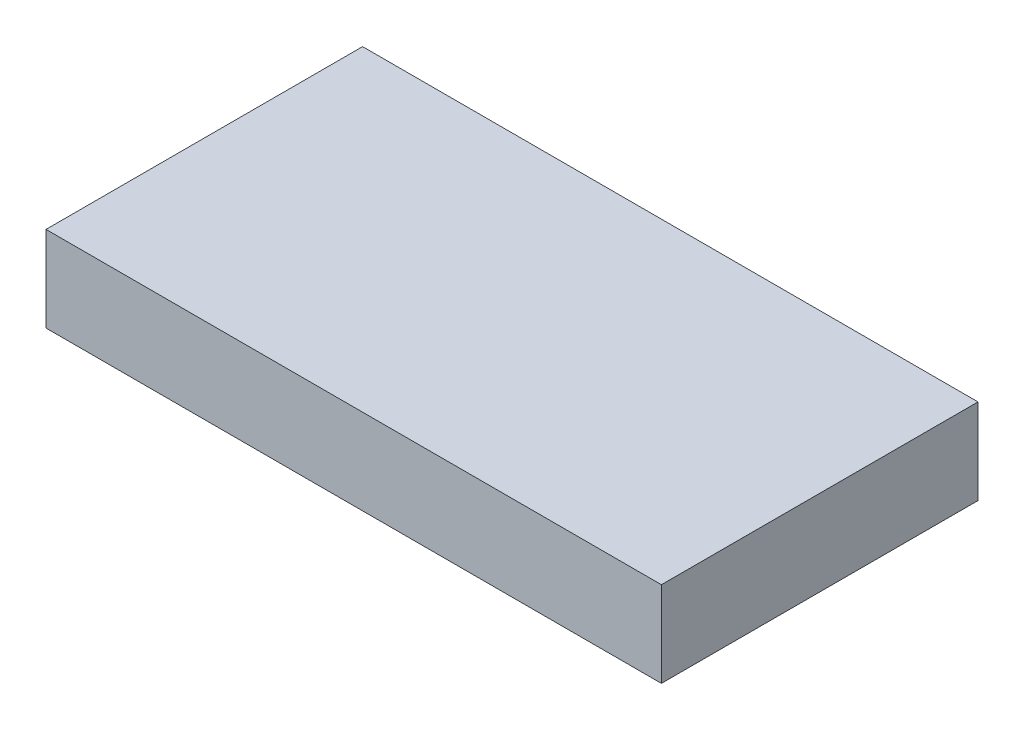
ISO-10303-21;
HEADER;
FILE_DESCRIPTION(('STEP AP214'),'2;1');
FILE_NAME('part.step','',(''),(''),'','','');
FILE_SCHEMA(('AUTOMOTIVE_DESIGN { 1 0 10303 214 1 1 1 1 }'));
ENDSEC;
DATA;
#1=APPLICATION_CONTEXT('core data for automotive mechanical design processes');
#2=APPLICATION_PROTOCOL_DEFINITION('international standard','automotive_design',2000,#1);
#3=PRODUCT_CONTEXT('',#1,'mechanical');
#4=PRODUCT('Part','Part','',(#3));
#5=PRODUCT_RELATED_PRODUCT_CATEGORY('part','',(#4));
#6=PRODUCT_DEFINITION_FORMATION('','',#4);
#7=PRODUCT_DEFINITION_CONTEXT('part definition',#1,'design');
#8=PRODUCT_DEFINITION('design','',#6,#7);
#9=PRODUCT_DEFINITION_SHAPE('','',#8);
#10=(LENGTH_UNIT() NAMED_UNIT(*) SI_UNIT(.MILLI.,.METRE.));
#11=(NAMED_UNIT(*) PLANE_ANGLE_UNIT() SI_UNIT($,.RADIAN.));
#12=(NAMED_UNIT(*) SI_UNIT($,.STERADIAN.) SOLID_ANGLE_UNIT());
#13=UNCERTAINTY_MEASURE_WITH_UNIT(LENGTH_MEASURE(1.E-05),#10,'distance_accuracy_value','');
#14=(GEOMETRIC_REPRESENTATION_CONTEXT(3) GLOBAL_UNCERTAINTY_ASSIGNED_CONTEXT((#13)) GLOBAL_UNIT_ASSIGNED_CONTEXT((#10,
#11,#12)) REPRESENTATION_CONTEXT('',''));
#15=CARTESIAN_POINT('',(0.,0.,0.));
#16=DIRECTION('',(0.,0.,1.));
#17=DIRECTION('',(1.,0.,0.));
#18=AXIS2_PLACEMENT_3D('',#15,#16,#17);
#19=CARTESIAN_POINT('',(0.,31.75,0.));
#20=DIRECTION('',(1.,0.,0.));
#21=DIRECTION('',(0.,0.,-1.));
#22=AXIS2_PLACEMENT_3D('',#19,#20,#21);
#23=PLANE('',#22);
#24=DIRECTION('',(0.,0.,1.));
#25=VECTOR('',#24,1.);
#26=CARTESIAN_POINT('',(0.,0.,0.));
#27=LINE('',#26,#25);
#28=CARTESIAN_POINT('',(0.,0.,-117.602));
#29=VERTEX_POINT('',#28);
#30=CARTESIAN_POINT('',(0.,0.,0.));
#31=VERTEX_POINT('',#30);
#32=EDGE_CURVE('E106',#29,#31,#27,.T.);
#33=ORIENTED_EDGE('',*,*,#32,.T.);
#34=DIRECTION('',(0.,-1.,0.));
#35=VECTOR('',#34,1.);
#36=CARTESIAN_POINT('',(0.,31.75,0.));
#37=LINE('',#36,#35);
#38=CARTESIAN_POINT('',(0.,31.75,0.));
#39=VERTEX_POINT('',#38);
#40=EDGE_CURVE('E11',#39,#31,#37,.T.);
#41=ORIENTED_EDGE('',*,*,#40,.F.);
#42=DIRECTION('',(0.,0.,1.));
#43=VECTOR('',#42,1.);
#44=CARTESIAN_POINT('',(0.,31.75,0.));
#45=LINE('',#44,#43);
#46=CARTESIAN_POINT('',(0.,31.75,-117.602));
#47=VERTEX_POINT('',#46);
#48=EDGE_CURVE('E94',#47,#39,#45,.T.);
#49=ORIENTED_EDGE('',*,*,#48,.F.);
#50=DIRECTION('',(0.,-1.,0.));
#51=VECTOR('',#50,1.);
#52=CARTESIAN_POINT('',(0.,31.75,-117.602));
#53=LINE('',#52,#51);
#54=EDGE_CURVE('E102',#47,#29,#53,.T.);
#55=ORIENTED_EDGE('',*,*,#54,.T.);
#56=EDGE_LOOP('',(#33,#41,#49,#55));
#57=FACE_BOUND('',#56,.T.);
#58=ADVANCED_FACE('F43',(#57),#23,.F.);
#59=CARTESIAN_POINT('',(0.,31.75,0.));
#60=DIRECTION('',(0.,0.,-1.));
#61=DIRECTION('',(-1.,0.,0.));
#62=AXIS2_PLACEMENT_3D('',#59,#60,#61);
#63=PLANE('',#62);
#64=DIRECTION('',(1.,0.,0.));
#65=VECTOR('',#64,1.);
#66=CARTESIAN_POINT('',(0.,0.,0.));
#67=LINE('',#66,#65);
#68=CARTESIAN_POINT('',(228.6,0.,0.));
#69=VERTEX_POINT('',#68);
#70=EDGE_CURVE('E98',#31,#69,#67,.T.);
#71=ORIENTED_EDGE('',*,*,#70,.T.);
#72=DIRECTION('',(0.,-1.,0.));
#73=VECTOR('',#72,1.);
#74=CARTESIAN_POINT('',(228.6,31.75,0.));
#75=LINE('',#74,#73);
#76=CARTESIAN_POINT('',(228.6,31.75,0.));
#77=VERTEX_POINT('',#76);
#78=EDGE_CURVE('E51',#77,#69,#75,.T.);
#79=ORIENTED_EDGE('',*,*,#78,.F.);
#80=DIRECTION('',(1.,0.,0.));
#81=VECTOR('',#80,1.);
#82=CARTESIAN_POINT('',(0.,31.75,0.));
#83=LINE('',#82,#81);
#84=EDGE_CURVE('E89',#39,#77,#83,.T.);
#85=ORIENTED_EDGE('',*,*,#84,.F.);
#86=ORIENTED_EDGE('',*,*,#40,.T.);
#87=EDGE_LOOP('',(#71,#79,#85,#86));
#88=FACE_BOUND('',#87,.T.);
#89=ADVANCED_FACE('F97',(#88),#63,.F.);
#90=CARTESIAN_POINT('',(228.6,31.75,0.));
#91=DIRECTION('',(-1.,0.,0.));
#92=DIRECTION('',(0.,0.,1.));
#93=AXIS2_PLACEMENT_3D('',#90,#91,#92);
#94=PLANE('',#93);
#95=DIRECTION('',(0.,0.,-1.));
#96=VECTOR('',#95,1.);
#97=CARTESIAN_POINT('',(228.6,0.,0.));
#98=LINE('',#97,#96);
#99=CARTESIAN_POINT('',(228.6,0.,-117.602));
#100=VERTEX_POINT('',#99);
#101=EDGE_CURVE('E76',#69,#100,#98,.T.);
#102=ORIENTED_EDGE('',*,*,#101,.T.);
#103=DIRECTION('',(0.,-1.,0.));
#104=VECTOR('',#103,1.);
#105=CARTESIAN_POINT('',(228.6,31.75,-117.602));
#106=LINE('',#105,#104);
#107=CARTESIAN_POINT('',(228.6,31.75,-117.602));
#108=VERTEX_POINT('',#107);
#109=EDGE_CURVE('E99',#108,#100,#106,.T.);
#110=ORIENTED_EDGE('',*,*,#109,.F.);
#111=DIRECTION('',(0.,0.,-1.));
#112=VECTOR('',#111,1.);
#113=CARTESIAN_POINT('',(228.6,31.75,0.));
#114=LINE('',#113,#112);
#115=EDGE_CURVE('E92',#77,#108,#114,.T.);
#116=ORIENTED_EDGE('',*,*,#115,.F.);
#117=ORIENTED_EDGE('',*,*,#78,.T.);
#118=EDGE_LOOP('',(#102,#110,#116,#117));
#119=FACE_BOUND('',#118,.T.);
#120=ADVANCED_FACE('F100',(#119),#94,.F.);
#121=CARTESIAN_POINT('',(0.,31.75,-117.602));
#122=DIRECTION('',(0.,0.,1.));
#123=DIRECTION('',(1.,0.,0.));
#124=AXIS2_PLACEMENT_3D('',#121,#122,#123);
#125=PLANE('',#124);
#126=DIRECTION('',(-1.,0.,0.));
#127=VECTOR('',#126,1.);
#128=CARTESIAN_POINT('',(0.,0.,-117.602));
#129=LINE('',#128,#127);
#130=EDGE_CURVE('E82',#100,#29,#129,.T.);
#131=ORIENTED_EDGE('',*,*,#130,.T.);
#132=ORIENTED_EDGE('',*,*,#54,.F.);
#133=DIRECTION('',(-1.,0.,0.));
#134=VECTOR('',#133,1.);
#135=CARTESIAN_POINT('',(0.,31.75,-117.602));
#136=LINE('',#135,#134);
#137=EDGE_CURVE('E59',#108,#47,#136,.T.);
#138=ORIENTED_EDGE('',*,*,#137,.F.);
#139=ORIENTED_EDGE('',*,*,#109,.T.);
#140=EDGE_LOOP('',(#131,#132,#138,#139));
#141=FACE_BOUND('',#140,.T.);
#142=ADVANCED_FACE('F113',(#141),#125,.F.);
#143=CARTESIAN_POINT('',(0.,31.75,0.));
#144=DIRECTION('',(0.,-1.,0.));
#145=DIRECTION('',(0.,0.,-1.));
#146=AXIS2_PLACEMENT_3D('',#143,#144,#145);
#147=PLANE('',#146);
#148=ORIENTED_EDGE('',*,*,#48,.T.);
#149=ORIENTED_EDGE('',*,*,#84,.T.);
#150=ORIENTED_EDGE('',*,*,#115,.T.);
#151=ORIENTED_EDGE('',*,*,#137,.T.);
#152=EDGE_LOOP('',(#148,#149,#150,#151));
#153=FACE_BOUND('',#152,.T.);
#154=ADVANCED_FACE('F90',(#153),#147,.F.);
#155=CARTESIAN_POINT('',(0.,0.,0.));
#156=DIRECTION('',(0.,-1.,0.));
#157=DIRECTION('',(0.,0.,-1.));
#158=AXIS2_PLACEMENT_3D('',#155,#156,#157);
#159=PLANE('',#158);
#160=ORIENTED_EDGE('',*,*,#32,.F.);
#161=ORIENTED_EDGE('',*,*,#130,.F.);
#162=ORIENTED_EDGE('',*,*,#101,.F.);
#163=ORIENTED_EDGE('',*,*,#70,.F.);
#164=EDGE_LOOP('',(#160,#161,#162,#163));
#165=FACE_BOUND('',#164,.T.);
#166=ADVANCED_FACE('F116',(#165),#159,.T.);
#167=CLOSED_SHELL('',(#58,#89,#120,#142,#154,#166));
#168=MANIFOLD_SOLID_BREP('B2',#167);
#169=ADVANCED_BREP_SHAPE_REPRESENTATION('',(#18,#168),#14);
#170=SHAPE_DEFINITION_REPRESENTATION(#9,#169);
ENDSEC;
END-ISO-10303-21;
